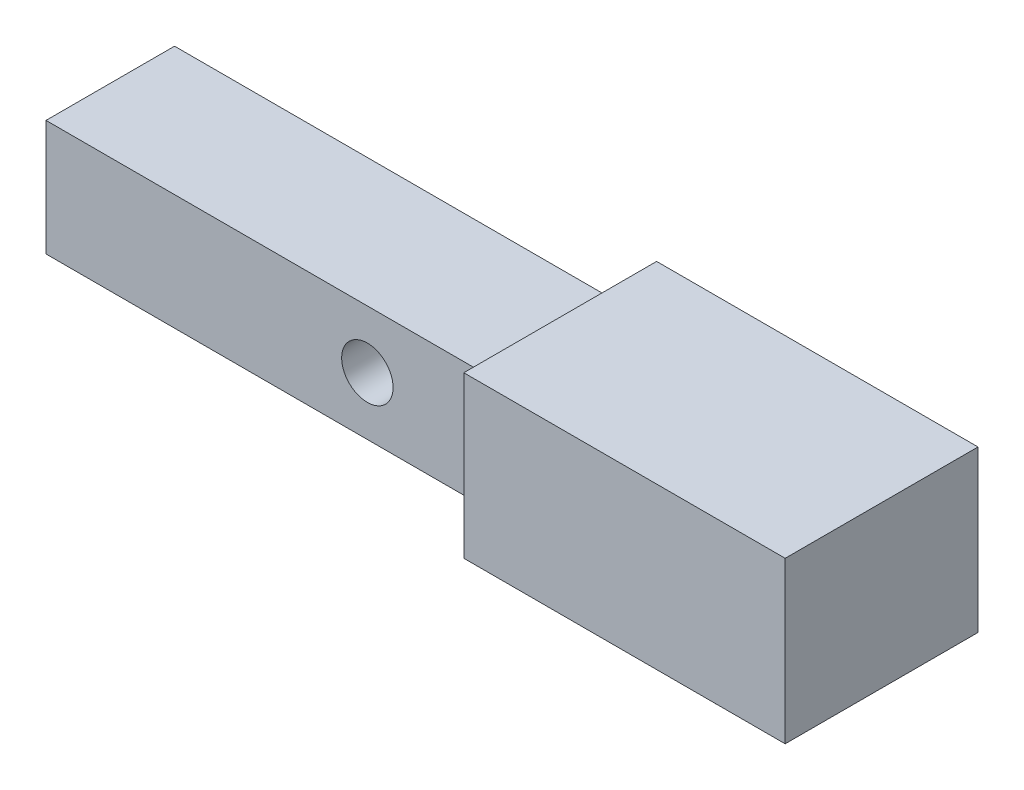
ISO-10303-21;
HEADER;
FILE_DESCRIPTION(('STEP AP214'),'2;1');
FILE_NAME('part.step','',(''),(''),'','','');
FILE_SCHEMA(('AUTOMOTIVE_DESIGN { 1 0 10303 214 1 1 1 1 }'));
ENDSEC;
DATA;
#1=APPLICATION_CONTEXT('core data for automotive mechanical design processes');
#2=APPLICATION_PROTOCOL_DEFINITION('international standard','automotive_design',2000,#1);
#3=PRODUCT_CONTEXT('',#1,'mechanical');
#4=PRODUCT('Part','Part','',(#3));
#5=PRODUCT_RELATED_PRODUCT_CATEGORY('part','',(#4));
#6=PRODUCT_DEFINITION_FORMATION('','',#4);
#7=PRODUCT_DEFINITION_CONTEXT('part definition',#1,'design');
#8=PRODUCT_DEFINITION('design','',#6,#7);
#9=PRODUCT_DEFINITION_SHAPE('','',#8);
#10=(LENGTH_UNIT() NAMED_UNIT(*) SI_UNIT(.MILLI.,.METRE.));
#11=(NAMED_UNIT(*) PLANE_ANGLE_UNIT() SI_UNIT($,.RADIAN.));
#12=(NAMED_UNIT(*) SI_UNIT($,.STERADIAN.) SOLID_ANGLE_UNIT());
#13=UNCERTAINTY_MEASURE_WITH_UNIT(LENGTH_MEASURE(1.E-05),#10,'distance_accuracy_value','');
#14=(GEOMETRIC_REPRESENTATION_CONTEXT(3) GLOBAL_UNCERTAINTY_ASSIGNED_CONTEXT((#13)) GLOBAL_UNIT_ASSIGNED_CONTEXT((#10,
#11,#12)) REPRESENTATION_CONTEXT('',''));
#15=CARTESIAN_POINT('',(0.,0.,0.));
#16=DIRECTION('',(0.,0.,1.));
#17=DIRECTION('',(1.,0.,0.));
#18=AXIS2_PLACEMENT_3D('',#15,#16,#17);
#19=CARTESIAN_POINT('',(0.,-9.,20.));
#20=DIRECTION('',(0.,-1.,0.));
#21=DIRECTION('',(1.,0.,0.));
#22=AXIS2_PLACEMENT_3D('',#19,#20,#21);
#23=PLANE('',#22);
#24=DIRECTION('',(-1.,0.,0.));
#25=VECTOR('',#24,1.);
#26=CARTESIAN_POINT('',(0.,-9.,0.));
#27=LINE('',#26,#25);
#28=CARTESIAN_POINT('',(20.,-9.00000000000001,0.));
#29=VERTEX_POINT('',#28);
#30=CARTESIAN_POINT('',(-50.,-8.99999999999999,0.));
#31=VERTEX_POINT('',#30);
#32=EDGE_CURVE('E168',#29,#31,#27,.T.);
#33=ORIENTED_EDGE('',*,*,#32,.F.);
#34=DIRECTION('',(0.,0.,1.));
#35=VECTOR('',#34,1.);
#36=CARTESIAN_POINT('',(20.,-9.00000000000001,20.));
#37=LINE('',#36,#35);
#38=CARTESIAN_POINT('',(20.,-9.00000000000001,20.));
#39=VERTEX_POINT('',#38);
#40=EDGE_CURVE('E63',#29,#39,#37,.T.);
#41=ORIENTED_EDGE('',*,*,#40,.T.);
#42=DIRECTION('',(-1.,0.,0.));
#43=VECTOR('',#42,1.);
#44=CARTESIAN_POINT('',(0.,-9.,20.));
#45=LINE('',#44,#43);
#46=CARTESIAN_POINT('',(-50.,-8.99999999999999,20.));
#47=VERTEX_POINT('',#46);
#48=EDGE_CURVE('E153',#39,#47,#45,.T.);
#49=ORIENTED_EDGE('',*,*,#48,.T.);
#50=DIRECTION('',(0.,0.,-1.));
#51=VECTOR('',#50,1.);
#52=CARTESIAN_POINT('',(-50.,-8.99999999999999,20.));
#53=LINE('',#52,#51);
#54=EDGE_CURVE('E48',#47,#31,#53,.T.);
#55=ORIENTED_EDGE('',*,*,#54,.T.);
#56=EDGE_LOOP('',(#33,#41,#49,#55));
#57=FACE_BOUND('',#56,.T.);
#58=ADVANCED_FACE('F39',(#57),#23,.T.);
#59=CARTESIAN_POINT('',(0.,9.,20.));
#60=DIRECTION('',(0.,-1.,0.));
#61=DIRECTION('',(1.,0.,0.));
#62=AXIS2_PLACEMENT_3D('',#59,#60,#61);
#63=PLANE('',#62);
#64=DIRECTION('',(0.,0.,1.));
#65=VECTOR('',#64,1.);
#66=CARTESIAN_POINT('',(20.,9.00000000000001,20.));
#67=LINE('',#66,#65);
#68=CARTESIAN_POINT('',(20.,9.00000000000001,0.));
#69=VERTEX_POINT('',#68);
#70=CARTESIAN_POINT('',(20.,9.00000000000001,20.));
#71=VERTEX_POINT('',#70);
#72=EDGE_CURVE('E134',#69,#71,#67,.T.);
#73=ORIENTED_EDGE('',*,*,#72,.F.);
#74=DIRECTION('',(-1.,0.,0.));
#75=VECTOR('',#74,1.);
#76=CARTESIAN_POINT('',(0.,9.,0.));
#77=LINE('',#76,#75);
#78=CARTESIAN_POINT('',(-50.,8.99999999999999,0.));
#79=VERTEX_POINT('',#78);
#80=EDGE_CURVE('E171',#69,#79,#77,.T.);
#81=ORIENTED_EDGE('',*,*,#80,.T.);
#82=DIRECTION('',(0.,0.,-1.));
#83=VECTOR('',#82,1.);
#84=CARTESIAN_POINT('',(-50.,8.99999999999999,20.));
#85=LINE('',#84,#83);
#86=CARTESIAN_POINT('',(-50.,8.99999999999999,20.));
#87=VERTEX_POINT('',#86);
#88=EDGE_CURVE('E164',#87,#79,#85,.T.);
#89=ORIENTED_EDGE('',*,*,#88,.F.);
#90=DIRECTION('',(-1.,0.,0.));
#91=VECTOR('',#90,1.);
#92=CARTESIAN_POINT('',(0.,9.,20.));
#93=LINE('',#92,#91);
#94=EDGE_CURVE('E157',#71,#87,#93,.T.);
#95=ORIENTED_EDGE('',*,*,#94,.F.);
#96=EDGE_LOOP('',(#73,#81,#89,#95));
#97=FACE_BOUND('',#96,.T.);
#98=ADVANCED_FACE('F191',(#97),#63,.F.);
#99=CARTESIAN_POINT('',(0.,0.,20.));
#100=DIRECTION('',(0.,0.,1.));
#101=DIRECTION('',(1.,0.,0.));
#102=AXIS2_PLACEMENT_3D('',#99,#100,#101);
#103=PLANE('',#102);
#104=CARTESIAN_POINT('',(0.,0.,20.));
#105=DIRECTION('',(0.,0.,1.));
#106=DIRECTION('',(1.,0.,0.));
#107=AXIS2_PLACEMENT_3D('',#104,#105,#106);
#108=CIRCLE('',#107,4.);
#109=CARTESIAN_POINT('',(4.,0.,20.));
#110=VERTEX_POINT('',#109);
#111=EDGE_CURVE('E160',#110,#110,#108,.T.);
#112=ORIENTED_EDGE('',*,*,#111,.F.);
#113=EDGE_LOOP('',(#112));
#114=FACE_BOUND('',#113,.T.);
#115=ORIENTED_EDGE('',*,*,#48,.F.);
#116=DIRECTION('',(0.,1.,0.));
#117=VECTOR('',#116,1.);
#118=CARTESIAN_POINT('',(20.,0.,20.));
#119=LINE('',#118,#117);
#120=EDGE_CURVE('E55',#39,#71,#119,.T.);
#121=ORIENTED_EDGE('',*,*,#120,.T.);
#122=ORIENTED_EDGE('',*,*,#94,.T.);
#123=DIRECTION('',(0.,-1.,0.));
#124=VECTOR('',#123,1.);
#125=CARTESIAN_POINT('',(-50.,0.,20.));
#126=LINE('',#125,#124);
#127=EDGE_CURVE('E149',#87,#47,#126,.T.);
#128=ORIENTED_EDGE('',*,*,#127,.T.);
#129=EDGE_LOOP('',(#115,#121,#122,#128));
#130=FACE_BOUND('',#129,.T.);
#131=ADVANCED_FACE('F192',(#114,#130),#103,.T.);
#132=CARTESIAN_POINT('',(0.,0.,0.));
#133=DIRECTION('',(0.,0.,1.));
#134=DIRECTION('',(1.,0.,0.));
#135=AXIS2_PLACEMENT_3D('',#132,#133,#134);
#136=PLANE('',#135);
#137=CARTESIAN_POINT('',(0.,0.,0.));
#138=DIRECTION('',(0.,0.,1.));
#139=DIRECTION('',(1.,0.,0.));
#140=AXIS2_PLACEMENT_3D('',#137,#138,#139);
#141=CIRCLE('',#140,4.);
#142=CARTESIAN_POINT('',(4.,0.,0.));
#143=VERTEX_POINT('',#142);
#144=EDGE_CURVE('E154',#143,#143,#141,.T.);
#145=ORIENTED_EDGE('',*,*,#144,.T.);
#146=EDGE_LOOP('',(#145));
#147=FACE_BOUND('',#146,.T.);
#148=DIRECTION('',(0.,1.,0.));
#149=VECTOR('',#148,1.);
#150=CARTESIAN_POINT('',(20.,0.,0.));
#151=LINE('',#150,#149);
#152=EDGE_CURVE('E11',#29,#69,#151,.T.);
#153=ORIENTED_EDGE('',*,*,#152,.F.);
#154=ORIENTED_EDGE('',*,*,#32,.T.);
#155=DIRECTION('',(0.,-1.,0.));
#156=VECTOR('',#155,1.);
#157=CARTESIAN_POINT('',(-50.,0.,0.));
#158=LINE('',#157,#156);
#159=EDGE_CURVE('E148',#79,#31,#158,.T.);
#160=ORIENTED_EDGE('',*,*,#159,.F.);
#161=ORIENTED_EDGE('',*,*,#80,.F.);
#162=EDGE_LOOP('',(#153,#154,#160,#161));
#163=FACE_BOUND('',#162,.T.);
#164=ADVANCED_FACE('F187',(#147,#163),#136,.F.);
#165=CARTESIAN_POINT('',(-50.,0.,20.));
#166=DIRECTION('',(1.,0.,0.));
#167=DIRECTION('',(0.,0.,-1.));
#168=AXIS2_PLACEMENT_3D('',#165,#166,#167);
#169=PLANE('',#168);
#170=ORIENTED_EDGE('',*,*,#159,.T.);
#171=ORIENTED_EDGE('',*,*,#54,.F.);
#172=ORIENTED_EDGE('',*,*,#127,.F.);
#173=ORIENTED_EDGE('',*,*,#88,.T.);
#174=EDGE_LOOP('',(#170,#171,#172,#173));
#175=FACE_BOUND('',#174,.T.);
#176=ADVANCED_FACE('F41',(#175),#169,.F.);
#177=CARTESIAN_POINT('',(0.,0.,20.));
#178=DIRECTION('',(0.,0.,-1.));
#179=DIRECTION('',(-1.,0.,0.));
#180=AXIS2_PLACEMENT_3D('',#177,#178,#179);
#181=CYLINDRICAL_SURFACE('',#180,4.);
#182=ORIENTED_EDGE('',*,*,#111,.T.);
#183=EDGE_LOOP('',(#182));
#184=FACE_BOUND('',#183,.T.);
#185=ORIENTED_EDGE('',*,*,#144,.F.);
#186=EDGE_LOOP('',(#185));
#187=FACE_BOUND('',#186,.T.);
#188=ADVANCED_FACE('F210',(#184,#187),#181,.F.);
#189=CARTESIAN_POINT('',(20.,-12.5,25.));
#190=DIRECTION('',(1.,0.,0.));
#191=DIRECTION('',(0.,0.,-1.));
#192=AXIS2_PLACEMENT_3D('',#189,#190,#191);
#193=PLANE('',#192);
#194=ORIENTED_EDGE('',*,*,#120,.F.);
#195=ORIENTED_EDGE('',*,*,#40,.F.);
#196=ORIENTED_EDGE('',*,*,#152,.T.);
#197=ORIENTED_EDGE('',*,*,#72,.T.);
#198=EDGE_LOOP('',(#194,#195,#196,#197));
#199=FACE_BOUND('',#198,.T.);
#200=DIRECTION('',(0.,-1.,0.));
#201=VECTOR('',#200,1.);
#202=CARTESIAN_POINT('',(20.,-12.5,-5.));
#203=LINE('',#202,#201);
#204=CARTESIAN_POINT('',(20.,12.5,-5.));
#205=VERTEX_POINT('',#204);
#206=CARTESIAN_POINT('',(20.,-12.5,-5.));
#207=VERTEX_POINT('',#206);
#208=EDGE_CURVE('E132',#205,#207,#203,.T.);
#209=ORIENTED_EDGE('',*,*,#208,.T.);
#210=DIRECTION('',(0.,0.,-1.));
#211=VECTOR('',#210,1.);
#212=CARTESIAN_POINT('',(20.,-12.5,25.));
#213=LINE('',#212,#211);
#214=CARTESIAN_POINT('',(20.,-12.5,25.));
#215=VERTEX_POINT('',#214);
#216=EDGE_CURVE('E110',#215,#207,#213,.T.);
#217=ORIENTED_EDGE('',*,*,#216,.F.);
#218=DIRECTION('',(0.,-1.,0.));
#219=VECTOR('',#218,1.);
#220=CARTESIAN_POINT('',(20.,-12.5,25.));
#221=LINE('',#220,#219);
#222=CARTESIAN_POINT('',(20.,12.5,25.));
#223=VERTEX_POINT('',#222);
#224=EDGE_CURVE('E118',#223,#215,#221,.T.);
#225=ORIENTED_EDGE('',*,*,#224,.F.);
#226=DIRECTION('',(0.,0.,-1.));
#227=VECTOR('',#226,1.);
#228=CARTESIAN_POINT('',(20.,12.5,25.));
#229=LINE('',#228,#227);
#230=EDGE_CURVE('E333',#223,#205,#229,.T.);
#231=ORIENTED_EDGE('',*,*,#230,.T.);
#232=EDGE_LOOP('',(#209,#217,#225,#231));
#233=FACE_BOUND('',#232,.T.);
#234=ADVANCED_FACE('F130',(#199,#233),#193,.F.);
#235=CARTESIAN_POINT('',(20.,-12.5,25.));
#236=DIRECTION('',(0.,1.,0.));
#237=DIRECTION('',(0.,0.,1.));
#238=AXIS2_PLACEMENT_3D('',#235,#236,#237);
#239=PLANE('',#238);
#240=DIRECTION('',(1.,0.,0.));
#241=VECTOR('',#240,1.);
#242=CARTESIAN_POINT('',(20.,-12.5,-5.));
#243=LINE('',#242,#241);
#244=CARTESIAN_POINT('',(70.,-12.5,-5.));
#245=VERTEX_POINT('',#244);
#246=EDGE_CURVE('E320',#207,#245,#243,.T.);
#247=ORIENTED_EDGE('',*,*,#246,.T.);
#248=DIRECTION('',(0.,0.,-1.));
#249=VECTOR('',#248,1.);
#250=CARTESIAN_POINT('',(70.,-12.5,25.));
#251=LINE('',#250,#249);
#252=CARTESIAN_POINT('',(70.,-12.5,25.));
#253=VERTEX_POINT('',#252);
#254=EDGE_CURVE('E113',#253,#245,#251,.T.);
#255=ORIENTED_EDGE('',*,*,#254,.F.);
#256=DIRECTION('',(1.,0.,0.));
#257=VECTOR('',#256,1.);
#258=CARTESIAN_POINT('',(20.,-12.5,25.));
#259=LINE('',#258,#257);
#260=EDGE_CURVE('E106',#215,#253,#259,.T.);
#261=ORIENTED_EDGE('',*,*,#260,.F.);
#262=ORIENTED_EDGE('',*,*,#216,.T.);
#263=EDGE_LOOP('',(#247,#255,#261,#262));
#264=FACE_BOUND('',#263,.T.);
#265=ADVANCED_FACE('F108',(#264),#239,.F.);
#266=CARTESIAN_POINT('',(70.,-12.5,25.));
#267=DIRECTION('',(-1.,0.,0.));
#268=DIRECTION('',(0.,0.,1.));
#269=AXIS2_PLACEMENT_3D('',#266,#267,#268);
#270=PLANE('',#269);
#271=DIRECTION('',(0.,1.,0.));
#272=VECTOR('',#271,1.);
#273=CARTESIAN_POINT('',(70.,-12.5,-5.));
#274=LINE('',#273,#272);
#275=CARTESIAN_POINT('',(70.,12.5,-5.));
#276=VERTEX_POINT('',#275);
#277=EDGE_CURVE('E324',#245,#276,#274,.T.);
#278=ORIENTED_EDGE('',*,*,#277,.T.);
#279=DIRECTION('',(0.,0.,-1.));
#280=VECTOR('',#279,1.);
#281=CARTESIAN_POINT('',(70.,12.5,25.));
#282=LINE('',#281,#280);
#283=CARTESIAN_POINT('',(70.,12.5,25.));
#284=VERTEX_POINT('',#283);
#285=EDGE_CURVE('E140',#284,#276,#282,.T.);
#286=ORIENTED_EDGE('',*,*,#285,.F.);
#287=DIRECTION('',(0.,1.,0.));
#288=VECTOR('',#287,1.);
#289=CARTESIAN_POINT('',(70.,-12.5,25.));
#290=LINE('',#289,#288);
#291=EDGE_CURVE('E117',#253,#284,#290,.T.);
#292=ORIENTED_EDGE('',*,*,#291,.F.);
#293=ORIENTED_EDGE('',*,*,#254,.T.);
#294=EDGE_LOOP('',(#278,#286,#292,#293));
#295=FACE_BOUND('',#294,.T.);
#296=ADVANCED_FACE('F277',(#295),#270,.F.);
#297=CARTESIAN_POINT('',(20.,12.5,25.));
#298=DIRECTION('',(0.,-1.,0.));
#299=DIRECTION('',(0.,0.,-1.));
#300=AXIS2_PLACEMENT_3D('',#297,#298,#299);
#301=PLANE('',#300);
#302=DIRECTION('',(-1.,0.,0.));
#303=VECTOR('',#302,1.);
#304=CARTESIAN_POINT('',(20.,12.5,-5.));
#305=LINE('',#304,#303);
#306=EDGE_CURVE('E128',#276,#205,#305,.T.);
#307=ORIENTED_EDGE('',*,*,#306,.T.);
#308=ORIENTED_EDGE('',*,*,#230,.F.);
#309=DIRECTION('',(-1.,0.,0.));
#310=VECTOR('',#309,1.);
#311=CARTESIAN_POINT('',(20.,12.5,25.));
#312=LINE('',#311,#310);
#313=EDGE_CURVE('E123',#284,#223,#312,.T.);
#314=ORIENTED_EDGE('',*,*,#313,.F.);
#315=ORIENTED_EDGE('',*,*,#285,.T.);
#316=EDGE_LOOP('',(#307,#308,#314,#315));
#317=FACE_BOUND('',#316,.T.);
#318=ADVANCED_FACE('F285',(#317),#301,.F.);
#319=CARTESIAN_POINT('',(0.,0.,25.));
#320=DIRECTION('',(0.,0.,-1.));
#321=DIRECTION('',(-1.,0.,0.));
#322=AXIS2_PLACEMENT_3D('',#319,#320,#321);
#323=PLANE('',#322);
#324=ORIENTED_EDGE('',*,*,#224,.T.);
#325=ORIENTED_EDGE('',*,*,#260,.T.);
#326=ORIENTED_EDGE('',*,*,#291,.T.);
#327=ORIENTED_EDGE('',*,*,#313,.T.);
#328=EDGE_LOOP('',(#324,#325,#326,#327));
#329=FACE_BOUND('',#328,.T.);
#330=ADVANCED_FACE('F121',(#329),#323,.F.);
#331=CARTESIAN_POINT('',(0.,0.,-5.));
#332=DIRECTION('',(0.,0.,-1.));
#333=DIRECTION('',(-1.,0.,0.));
#334=AXIS2_PLACEMENT_3D('',#331,#332,#333);
#335=PLANE('',#334);
#336=ORIENTED_EDGE('',*,*,#208,.F.);
#337=ORIENTED_EDGE('',*,*,#306,.F.);
#338=ORIENTED_EDGE('',*,*,#277,.F.);
#339=ORIENTED_EDGE('',*,*,#246,.F.);
#340=EDGE_LOOP('',(#336,#337,#338,#339));
#341=FACE_BOUND('',#340,.T.);
#342=ADVANCED_FACE('F302',(#341),#335,.T.);
#343=CLOSED_SHELL('',(#58,#98,#131,#164,#176,#188,#234,#265,#296,#318,#330,#342));
#344=MANIFOLD_SOLID_BREP('B2',#343);
#345=ADVANCED_BREP_SHAPE_REPRESENTATION('',(#18,#344),#14);
#346=SHAPE_DEFINITION_REPRESENTATION(#9,#345);
ENDSEC;
END-ISO-10303-21;
